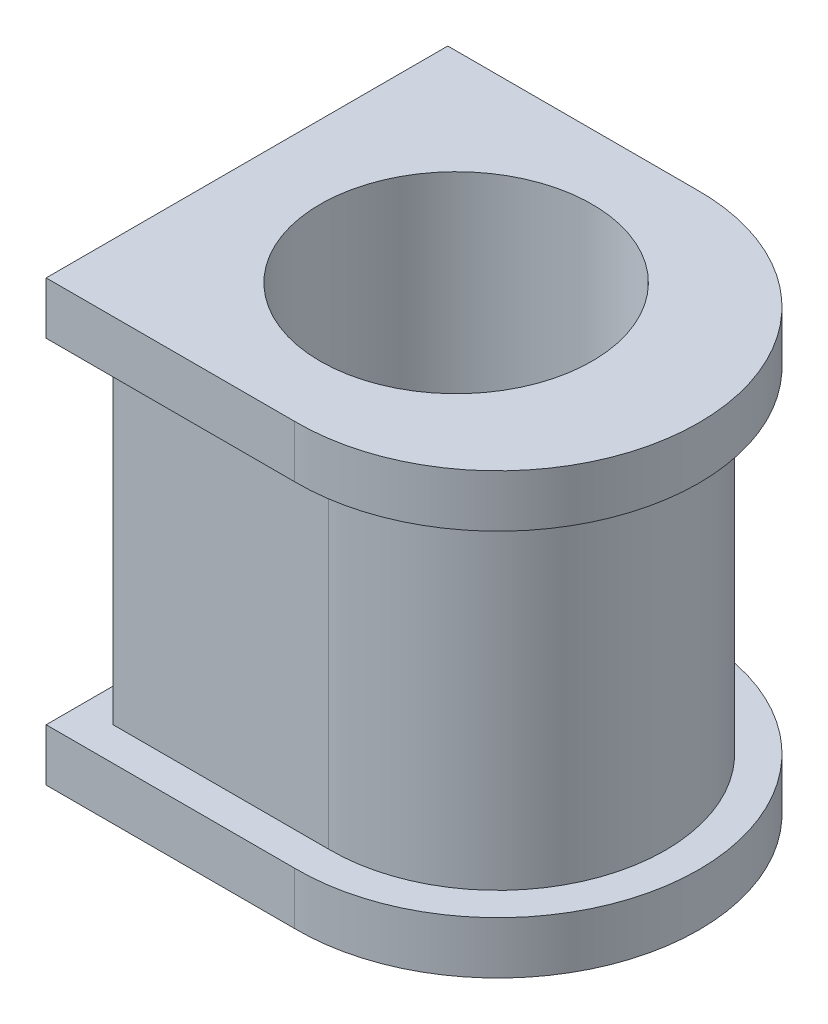
ISO-10303-21;
HEADER;
FILE_DESCRIPTION(('STEP AP214'),'2;1');
FILE_NAME('part.step','',(''),(''),'','','');
FILE_SCHEMA(('AUTOMOTIVE_DESIGN { 1 0 10303 214 1 1 1 1 }'));
ENDSEC;
DATA;
#1=APPLICATION_CONTEXT('core data for automotive mechanical design processes');
#2=APPLICATION_PROTOCOL_DEFINITION('international standard','automotive_design',2000,#1);
#3=PRODUCT_CONTEXT('',#1,'mechanical');
#4=PRODUCT('Part','Part','',(#3));
#5=PRODUCT_RELATED_PRODUCT_CATEGORY('part','',(#4));
#6=PRODUCT_DEFINITION_FORMATION('','',#4);
#7=PRODUCT_DEFINITION_CONTEXT('part definition',#1,'design');
#8=PRODUCT_DEFINITION('design','',#6,#7);
#9=PRODUCT_DEFINITION_SHAPE('','',#8);
#10=(LENGTH_UNIT() NAMED_UNIT(*) SI_UNIT(.MILLI.,.METRE.));
#11=(NAMED_UNIT(*) PLANE_ANGLE_UNIT() SI_UNIT($,.RADIAN.));
#12=(NAMED_UNIT(*) SI_UNIT($,.STERADIAN.) SOLID_ANGLE_UNIT());
#13=UNCERTAINTY_MEASURE_WITH_UNIT(LENGTH_MEASURE(1.E-05),#10,'distance_accuracy_value','');
#14=(GEOMETRIC_REPRESENTATION_CONTEXT(3) GLOBAL_UNCERTAINTY_ASSIGNED_CONTEXT((#13)) GLOBAL_UNIT_ASSIGNED_CONTEXT((#10,
#11,#12)) REPRESENTATION_CONTEXT('',''));
#15=CARTESIAN_POINT('',(0.,0.,0.));
#16=DIRECTION('',(0.,0.,1.));
#17=DIRECTION('',(1.,0.,0.));
#18=AXIS2_PLACEMENT_3D('',#15,#16,#17);
#19=CARTESIAN_POINT('',(-26.,80.,-40.));
#20=DIRECTION('',(1.,0.,0.));
#21=DIRECTION('',(0.,0.,-1.));
#22=AXIS2_PLACEMENT_3D('',#19,#20,#21);
#23=PLANE('',#22);
#24=DIRECTION('',(0.,0.,1.));
#25=VECTOR('',#24,1.);
#26=CARTESIAN_POINT('',(-26.,0.,-40.));
#27=LINE('',#26,#25);
#28=CARTESIAN_POINT('',(-26.,0.,-40.));
#29=VERTEX_POINT('',#28);
#30=CARTESIAN_POINT('',(-26.,0.,40.));
#31=VERTEX_POINT('',#30);
#32=EDGE_CURVE('E199',#29,#31,#27,.T.);
#33=ORIENTED_EDGE('',*,*,#32,.T.);
#34=DIRECTION('',(0.,-1.,0.));
#35=VECTOR('',#34,1.);
#36=CARTESIAN_POINT('',(-26.,80.,40.));
#37=LINE('',#36,#35);
#38=CARTESIAN_POINT('',(-26.,80.,40.));
#39=VERTEX_POINT('',#38);
#40=EDGE_CURVE('E11',#39,#31,#37,.T.);
#41=ORIENTED_EDGE('',*,*,#40,.F.);
#42=DIRECTION('',(0.,0.,1.));
#43=VECTOR('',#42,1.);
#44=CARTESIAN_POINT('',(-26.,80.,-40.));
#45=LINE('',#44,#43);
#46=CARTESIAN_POINT('',(-26.,80.,-40.));
#47=VERTEX_POINT('',#46);
#48=EDGE_CURVE('E200',#47,#39,#45,.T.);
#49=ORIENTED_EDGE('',*,*,#48,.F.);
#50=DIRECTION('',(0.,-1.,0.));
#51=VECTOR('',#50,1.);
#52=CARTESIAN_POINT('',(-26.,80.,-40.));
#53=LINE('',#52,#51);
#54=EDGE_CURVE('E213',#47,#29,#53,.T.);
#55=ORIENTED_EDGE('',*,*,#54,.T.);
#56=EDGE_LOOP('',(#33,#41,#49,#55));
#57=FACE_BOUND('',#56,.T.);
#58=ADVANCED_FACE('F37',(#57),#23,.F.);
#59=CARTESIAN_POINT('',(-26.,80.,40.));
#60=DIRECTION('',(0.,0.,-1.));
#61=DIRECTION('',(-1.,0.,0.));
#62=AXIS2_PLACEMENT_3D('',#59,#60,#61);
#63=PLANE('',#62);
#64=DIRECTION('',(1.,0.,0.));
#65=VECTOR('',#64,1.);
#66=CARTESIAN_POINT('',(-26.,0.,40.));
#67=LINE('',#66,#65);
#68=CARTESIAN_POINT('',(25.4504857740027,0.,40.));
#69=VERTEX_POINT('',#68);
#70=EDGE_CURVE('E216',#31,#69,#67,.T.);
#71=ORIENTED_EDGE('',*,*,#70,.T.);
#72=DIRECTION('',(0.,-1.,0.));
#73=VECTOR('',#72,1.);
#74=CARTESIAN_POINT('',(25.4504857740027,80.,40.));
#75=LINE('',#74,#73);
#76=CARTESIAN_POINT('',(25.4504857740027,80.,40.));
#77=VERTEX_POINT('',#76);
#78=EDGE_CURVE('E45',#77,#69,#75,.T.);
#79=ORIENTED_EDGE('',*,*,#78,.F.);
#80=DIRECTION('',(1.,0.,0.));
#81=VECTOR('',#80,1.);
#82=CARTESIAN_POINT('',(-26.,80.,40.));
#83=LINE('',#82,#81);
#84=EDGE_CURVE('E203',#39,#77,#83,.T.);
#85=ORIENTED_EDGE('',*,*,#84,.F.);
#86=ORIENTED_EDGE('',*,*,#40,.T.);
#87=EDGE_LOOP('',(#71,#79,#85,#86));
#88=FACE_BOUND('',#87,.T.);
#89=ADVANCED_FACE('F229',(#88),#63,.F.);
#90=CARTESIAN_POINT('',(26.,80.,0.));
#91=DIRECTION('',(0.,-1.,0.));
#92=DIRECTION('',(0.,0.,-1.));
#93=AXIS2_PLACEMENT_3D('',#90,#91,#92);
#94=CYLINDRICAL_SURFACE('',#93,40.0037743954814);
#95=CARTESIAN_POINT('',(26.,0.,0.));
#96=DIRECTION('',(0.,1.,0.));
#97=DIRECTION('',(0.,0.,1.));
#98=AXIS2_PLACEMENT_3D('',#95,#96,#97);
#99=CIRCLE('',#98,40.0037743954814);
#100=CARTESIAN_POINT('',(25.4504857740032,0.,-40.));
#101=VERTEX_POINT('',#100);
#102=EDGE_CURVE('E219',#69,#101,#99,.T.);
#103=ORIENTED_EDGE('',*,*,#102,.T.);
#104=DIRECTION('',(0.,-1.,0.));
#105=VECTOR('',#104,1.);
#106=CARTESIAN_POINT('',(25.4504857740032,80.,-40.));
#107=LINE('',#106,#105);
#108=CARTESIAN_POINT('',(25.4504857740032,80.,-40.));
#109=VERTEX_POINT('',#108);
#110=EDGE_CURVE('E52',#109,#101,#107,.T.);
#111=ORIENTED_EDGE('',*,*,#110,.F.);
#112=CARTESIAN_POINT('',(26.,80.,0.));
#113=DIRECTION('',(0.,1.,0.));
#114=DIRECTION('',(0.,0.,1.));
#115=AXIS2_PLACEMENT_3D('',#112,#113,#114);
#116=CIRCLE('',#115,40.0037743954814);
#117=EDGE_CURVE('E207',#77,#109,#116,.T.);
#118=ORIENTED_EDGE('',*,*,#117,.F.);
#119=ORIENTED_EDGE('',*,*,#78,.T.);
#120=EDGE_LOOP('',(#103,#111,#118,#119));
#121=FACE_BOUND('',#120,.T.);
#122=ADVANCED_FACE('F226',(#121),#94,.T.);
#123=CARTESIAN_POINT('',(-26.,80.,-40.));
#124=DIRECTION('',(0.,0.,1.));
#125=DIRECTION('',(1.,0.,0.));
#126=AXIS2_PLACEMENT_3D('',#123,#124,#125);
#127=PLANE('',#126);
#128=DIRECTION('',(-1.,0.,0.));
#129=VECTOR('',#128,1.);
#130=CARTESIAN_POINT('',(-26.,0.,-40.));
#131=LINE('',#130,#129);
#132=EDGE_CURVE('E204',#101,#29,#131,.T.);
#133=ORIENTED_EDGE('',*,*,#132,.T.);
#134=ORIENTED_EDGE('',*,*,#54,.F.);
#135=DIRECTION('',(-1.,0.,0.));
#136=VECTOR('',#135,1.);
#137=CARTESIAN_POINT('',(-26.,80.,-40.));
#138=LINE('',#137,#136);
#139=EDGE_CURVE('E210',#109,#47,#138,.T.);
#140=ORIENTED_EDGE('',*,*,#139,.F.);
#141=ORIENTED_EDGE('',*,*,#110,.T.);
#142=EDGE_LOOP('',(#133,#134,#140,#141));
#143=FACE_BOUND('',#142,.T.);
#144=ADVANCED_FACE('F236',(#143),#127,.F.);
#145=CARTESIAN_POINT('',(16.0000000000003,80.,0.));
#146=DIRECTION('',(0.,-1.,0.));
#147=DIRECTION('',(0.,0.,-1.));
#148=AXIS2_PLACEMENT_3D('',#145,#146,#147);
#149=CYLINDRICAL_SURFACE('',#148,32.5);
#150=CARTESIAN_POINT('',(16.0000000000003,92.5,0.));
#151=DIRECTION('',(0.,1.,0.));
#152=DIRECTION('',(0.,0.,1.));
#153=AXIS2_PLACEMENT_3D('',#150,#151,#152);
#154=CIRCLE('',#153,32.5);
#155=CARTESIAN_POINT('',(16.0000000000003,92.5,32.5));
#156=VERTEX_POINT('',#155);
#157=EDGE_CURVE('E133',#156,#156,#154,.T.);
#158=ORIENTED_EDGE('',*,*,#157,.T.);
#159=EDGE_LOOP('',(#158));
#160=FACE_BOUND('',#159,.T.);
#161=CARTESIAN_POINT('',(16.0000000000003,-12.5,0.));
#162=DIRECTION('',(0.,1.,0.));
#163=DIRECTION('',(0.,0.,1.));
#164=AXIS2_PLACEMENT_3D('',#161,#162,#163);
#165=CIRCLE('',#164,32.5);
#166=CARTESIAN_POINT('',(16.0000000000003,-12.5,32.5));
#167=VERTEX_POINT('',#166);
#168=EDGE_CURVE('E156',#167,#167,#165,.T.);
#169=ORIENTED_EDGE('',*,*,#168,.F.);
#170=EDGE_LOOP('',(#169));
#171=FACE_BOUND('',#170,.T.);
#172=ADVANCED_FACE('F242',(#160,#171),#149,.F.);
#173=CARTESIAN_POINT('',(26.,80.,0.));
#174=DIRECTION('',(0.,1.,0.));
#175=DIRECTION('',(0.,0.,1.));
#176=AXIS2_PLACEMENT_3D('',#173,#174,#175);
#177=PLANE('',#176);
#178=DIRECTION('',(-1.,0.,0.));
#179=VECTOR('',#178,1.);
#180=CARTESIAN_POINT('',(25.3980396921105,80.,-48.));
#181=LINE('',#180,#179);
#182=CARTESIAN_POINT('',(25.3980396921105,80.,-48.));
#183=VERTEX_POINT('',#182);
#184=CARTESIAN_POINT('',(-34.,80.,-48.));
#185=VERTEX_POINT('',#184);
#186=EDGE_CURVE('E169',#183,#185,#181,.T.);
#187=ORIENTED_EDGE('',*,*,#186,.F.);
#188=CARTESIAN_POINT('',(26.,80.,0.));
#189=DIRECTION('',(0.,1.,0.));
#190=DIRECTION('',(0.,0.,1.));
#191=AXIS2_PLACEMENT_3D('',#188,#189,#190);
#192=CIRCLE('',#191,48.0037743954814);
#193=CARTESIAN_POINT('',(25.3980396921096,80.,48.));
#194=VERTEX_POINT('',#193);
#195=EDGE_CURVE('E174',#194,#183,#192,.T.);
#196=ORIENTED_EDGE('',*,*,#195,.F.);
#197=DIRECTION('',(1.,0.,0.));
#198=VECTOR('',#197,1.);
#199=CARTESIAN_POINT('',(-34.,80.,48.));
#200=LINE('',#199,#198);
#201=CARTESIAN_POINT('',(-34.,80.,48.));
#202=VERTEX_POINT('',#201);
#203=EDGE_CURVE('E185',#202,#194,#200,.T.);
#204=ORIENTED_EDGE('',*,*,#203,.F.);
#205=DIRECTION('',(0.,0.,1.));
#206=VECTOR('',#205,1.);
#207=CARTESIAN_POINT('',(-34.,80.,-48.));
#208=LINE('',#207,#206);
#209=EDGE_CURVE('E183',#185,#202,#208,.T.);
#210=ORIENTED_EDGE('',*,*,#209,.F.);
#211=EDGE_LOOP('',(#187,#196,#204,#210));
#212=FACE_BOUND('',#211,.T.);
#213=ORIENTED_EDGE('',*,*,#139,.T.);
#214=ORIENTED_EDGE('',*,*,#48,.T.);
#215=ORIENTED_EDGE('',*,*,#84,.T.);
#216=ORIENTED_EDGE('',*,*,#117,.T.);
#217=EDGE_LOOP('',(#213,#214,#215,#216));
#218=FACE_BOUND('',#217,.T.);
#219=ADVANCED_FACE('F239',(#212,#218),#177,.F.);
#220=CARTESIAN_POINT('',(26.,92.5,0.));
#221=DIRECTION('',(0.,1.,0.));
#222=DIRECTION('',(0.,0.,1.));
#223=AXIS2_PLACEMENT_3D('',#220,#221,#222);
#224=PLANE('',#223);
#225=DIRECTION('',(-1.,0.,0.));
#226=VECTOR('',#225,1.);
#227=CARTESIAN_POINT('',(25.3980396921105,92.5,-48.));
#228=LINE('',#227,#226);
#229=CARTESIAN_POINT('',(25.3980396921105,92.5,-48.));
#230=VERTEX_POINT('',#229);
#231=CARTESIAN_POINT('',(-34.,92.5,-48.));
#232=VERTEX_POINT('',#231);
#233=EDGE_CURVE('E170',#230,#232,#228,.T.);
#234=ORIENTED_EDGE('',*,*,#233,.T.);
#235=DIRECTION('',(0.,0.,1.));
#236=VECTOR('',#235,1.);
#237=CARTESIAN_POINT('',(-34.,92.5,-48.));
#238=LINE('',#237,#236);
#239=CARTESIAN_POINT('',(-34.,92.5,48.));
#240=VERTEX_POINT('',#239);
#241=EDGE_CURVE('E173',#232,#240,#238,.T.);
#242=ORIENTED_EDGE('',*,*,#241,.T.);
#243=DIRECTION('',(1.,0.,0.));
#244=VECTOR('',#243,1.);
#245=CARTESIAN_POINT('',(-34.,92.5,48.));
#246=LINE('',#245,#244);
#247=CARTESIAN_POINT('',(25.3980396921096,92.5,48.));
#248=VERTEX_POINT('',#247);
#249=EDGE_CURVE('E176',#240,#248,#246,.T.);
#250=ORIENTED_EDGE('',*,*,#249,.T.);
#251=CARTESIAN_POINT('',(26.,92.5,0.));
#252=DIRECTION('',(0.,1.,0.));
#253=DIRECTION('',(0.,0.,1.));
#254=AXIS2_PLACEMENT_3D('',#251,#252,#253);
#255=CIRCLE('',#254,48.0037743954814);
#256=EDGE_CURVE('E178',#248,#230,#255,.T.);
#257=ORIENTED_EDGE('',*,*,#256,.T.);
#258=EDGE_LOOP('',(#234,#242,#250,#257));
#259=FACE_BOUND('',#258,.T.);
#260=ORIENTED_EDGE('',*,*,#157,.F.);
#261=EDGE_LOOP('',(#260));
#262=FACE_BOUND('',#261,.T.);
#263=ADVANCED_FACE('F241',(#259,#262),#224,.T.);
#264=CARTESIAN_POINT('',(25.3980396921105,92.5,-48.));
#265=DIRECTION('',(0.,0.,1.));
#266=DIRECTION('',(1.,0.,0.));
#267=AXIS2_PLACEMENT_3D('',#264,#265,#266);
#268=PLANE('',#267);
#269=ORIENTED_EDGE('',*,*,#186,.T.);
#270=DIRECTION('',(0.,-1.,0.));
#271=VECTOR('',#270,1.);
#272=CARTESIAN_POINT('',(-34.,92.5,-48.));
#273=LINE('',#272,#271);
#274=EDGE_CURVE('E196',#232,#185,#273,.T.);
#275=ORIENTED_EDGE('',*,*,#274,.F.);
#276=ORIENTED_EDGE('',*,*,#233,.F.);
#277=DIRECTION('',(0.,-1.,0.));
#278=VECTOR('',#277,1.);
#279=CARTESIAN_POINT('',(25.3980396921105,92.5,-48.));
#280=LINE('',#279,#278);
#281=EDGE_CURVE('E180',#230,#183,#280,.T.);
#282=ORIENTED_EDGE('',*,*,#281,.T.);
#283=EDGE_LOOP('',(#269,#275,#276,#282));
#284=FACE_BOUND('',#283,.T.);
#285=ADVANCED_FACE('F249',(#284),#268,.F.);
#286=CARTESIAN_POINT('',(-34.,92.5,-48.));
#287=DIRECTION('',(1.,0.,0.));
#288=DIRECTION('',(0.,0.,-1.));
#289=AXIS2_PLACEMENT_3D('',#286,#287,#288);
#290=PLANE('',#289);
#291=ORIENTED_EDGE('',*,*,#209,.T.);
#292=DIRECTION('',(0.,-1.,0.));
#293=VECTOR('',#292,1.);
#294=CARTESIAN_POINT('',(-34.,92.5,48.));
#295=LINE('',#294,#293);
#296=EDGE_CURVE('E193',#240,#202,#295,.T.);
#297=ORIENTED_EDGE('',*,*,#296,.F.);
#298=ORIENTED_EDGE('',*,*,#241,.F.);
#299=ORIENTED_EDGE('',*,*,#274,.T.);
#300=EDGE_LOOP('',(#291,#297,#298,#299));
#301=FACE_BOUND('',#300,.T.);
#302=ADVANCED_FACE('F269',(#301),#290,.F.);
#303=CARTESIAN_POINT('',(-34.,92.5,48.));
#304=DIRECTION('',(0.,0.,-1.));
#305=DIRECTION('',(-1.,0.,0.));
#306=AXIS2_PLACEMENT_3D('',#303,#304,#305);
#307=PLANE('',#306);
#308=ORIENTED_EDGE('',*,*,#203,.T.);
#309=DIRECTION('',(0.,-1.,0.));
#310=VECTOR('',#309,1.);
#311=CARTESIAN_POINT('',(25.3980396921096,92.5,48.));
#312=LINE('',#311,#310);
#313=EDGE_CURVE('E190',#248,#194,#312,.T.);
#314=ORIENTED_EDGE('',*,*,#313,.F.);
#315=ORIENTED_EDGE('',*,*,#249,.F.);
#316=ORIENTED_EDGE('',*,*,#296,.T.);
#317=EDGE_LOOP('',(#308,#314,#315,#316));
#318=FACE_BOUND('',#317,.T.);
#319=ADVANCED_FACE('F273',(#318),#307,.F.);
#320=CARTESIAN_POINT('',(26.,92.5,0.));
#321=DIRECTION('',(0.,-1.,0.));
#322=DIRECTION('',(0.,0.,-1.));
#323=AXIS2_PLACEMENT_3D('',#320,#321,#322);
#324=CYLINDRICAL_SURFACE('',#323,48.0037743954814);
#325=ORIENTED_EDGE('',*,*,#195,.T.);
#326=ORIENTED_EDGE('',*,*,#281,.F.);
#327=ORIENTED_EDGE('',*,*,#256,.F.);
#328=ORIENTED_EDGE('',*,*,#313,.T.);
#329=EDGE_LOOP('',(#325,#326,#327,#328));
#330=FACE_BOUND('',#329,.T.);
#331=ADVANCED_FACE('F276',(#330),#324,.T.);
#332=CARTESIAN_POINT('',(25.3980396921105,-12.5,-48.));
#333=DIRECTION('',(0.,0.,-1.));
#334=DIRECTION('',(-1.,0.,0.));
#335=AXIS2_PLACEMENT_3D('',#332,#333,#334);
#336=PLANE('',#335);
#337=DIRECTION('',(-1.,0.,0.));
#338=VECTOR('',#337,1.);
#339=CARTESIAN_POINT('',(25.3980396921105,0.,-48.));
#340=LINE('',#339,#338);
#341=CARTESIAN_POINT('',(25.3980396921105,0.,-48.));
#342=VERTEX_POINT('',#341);
#343=CARTESIAN_POINT('',(-34.,0.,-48.));
#344=VERTEX_POINT('',#343);
#345=EDGE_CURVE('E128',#342,#344,#340,.T.);
#346=ORIENTED_EDGE('',*,*,#345,.F.);
#347=DIRECTION('',(0.,1.,0.));
#348=VECTOR('',#347,1.);
#349=CARTESIAN_POINT('',(25.3980396921105,-12.5,-48.));
#350=LINE('',#349,#348);
#351=CARTESIAN_POINT('',(25.3980396921105,-12.5,-48.));
#352=VERTEX_POINT('',#351);
#353=EDGE_CURVE('E122',#352,#342,#350,.T.);
#354=ORIENTED_EDGE('',*,*,#353,.F.);
#355=DIRECTION('',(-1.,0.,0.));
#356=VECTOR('',#355,1.);
#357=CARTESIAN_POINT('',(25.3980396921105,-12.5,-48.));
#358=LINE('',#357,#356);
#359=CARTESIAN_POINT('',(-34.,-12.5,-48.));
#360=VERTEX_POINT('',#359);
#361=EDGE_CURVE('E125',#352,#360,#358,.T.);
#362=ORIENTED_EDGE('',*,*,#361,.T.);
#363=DIRECTION('',(0.,1.,0.));
#364=VECTOR('',#363,1.);
#365=CARTESIAN_POINT('',(-34.,-12.5,-48.));
#366=LINE('',#365,#364);
#367=EDGE_CURVE('E153',#360,#344,#366,.T.);
#368=ORIENTED_EDGE('',*,*,#367,.T.);
#369=EDGE_LOOP('',(#346,#354,#362,#368));
#370=FACE_BOUND('',#369,.T.);
#371=ADVANCED_FACE('F124',(#370),#336,.T.);
#372=CARTESIAN_POINT('',(26.,-12.5,0.));
#373=DIRECTION('',(0.,1.,0.));
#374=DIRECTION('',(0.,0.,1.));
#375=AXIS2_PLACEMENT_3D('',#372,#373,#374);
#376=CYLINDRICAL_SURFACE('',#375,48.0037743954814);
#377=CARTESIAN_POINT('',(26.,0.,0.));
#378=DIRECTION('',(0.,1.,0.));
#379=DIRECTION('',(0.,0.,1.));
#380=AXIS2_PLACEMENT_3D('',#377,#378,#379);
#381=CIRCLE('',#380,48.0037743954814);
#382=CARTESIAN_POINT('',(25.3980396921096,0.,48.));
#383=VERTEX_POINT('',#382);
#384=EDGE_CURVE('E155',#383,#342,#381,.T.);
#385=ORIENTED_EDGE('',*,*,#384,.F.);
#386=DIRECTION('',(0.,1.,0.));
#387=VECTOR('',#386,1.);
#388=CARTESIAN_POINT('',(25.3980396921096,-12.5,48.));
#389=LINE('',#388,#387);
#390=CARTESIAN_POINT('',(25.3980396921096,-12.5,48.));
#391=VERTEX_POINT('',#390);
#392=EDGE_CURVE('E134',#391,#383,#389,.T.);
#393=ORIENTED_EDGE('',*,*,#392,.F.);
#394=CARTESIAN_POINT('',(26.,-12.5,0.));
#395=DIRECTION('',(0.,1.,0.));
#396=DIRECTION('',(0.,0.,1.));
#397=AXIS2_PLACEMENT_3D('',#394,#395,#396);
#398=CIRCLE('',#397,48.0037743954814);
#399=EDGE_CURVE('E140',#391,#352,#398,.T.);
#400=ORIENTED_EDGE('',*,*,#399,.T.);
#401=ORIENTED_EDGE('',*,*,#353,.T.);
#402=EDGE_LOOP('',(#385,#393,#400,#401));
#403=FACE_BOUND('',#402,.T.);
#404=ADVANCED_FACE('F146',(#403),#376,.T.);
#405=CARTESIAN_POINT('',(-34.,-12.5,48.));
#406=DIRECTION('',(0.,0.,1.));
#407=DIRECTION('',(1.,0.,0.));
#408=AXIS2_PLACEMENT_3D('',#405,#406,#407);
#409=PLANE('',#408);
#410=DIRECTION('',(1.,0.,0.));
#411=VECTOR('',#410,1.);
#412=CARTESIAN_POINT('',(-34.,0.,48.));
#413=LINE('',#412,#411);
#414=CARTESIAN_POINT('',(-34.,0.,48.));
#415=VERTEX_POINT('',#414);
#416=EDGE_CURVE('E158',#415,#383,#413,.T.);
#417=ORIENTED_EDGE('',*,*,#416,.F.);
#418=DIRECTION('',(0.,1.,0.));
#419=VECTOR('',#418,1.);
#420=CARTESIAN_POINT('',(-34.,-12.5,48.));
#421=LINE('',#420,#419);
#422=CARTESIAN_POINT('',(-34.,-12.5,48.));
#423=VERTEX_POINT('',#422);
#424=EDGE_CURVE('E164',#423,#415,#421,.T.);
#425=ORIENTED_EDGE('',*,*,#424,.F.);
#426=DIRECTION('',(1.,0.,0.));
#427=VECTOR('',#426,1.);
#428=CARTESIAN_POINT('',(-34.,-12.5,48.));
#429=LINE('',#428,#427);
#430=EDGE_CURVE('E147',#423,#391,#429,.T.);
#431=ORIENTED_EDGE('',*,*,#430,.T.);
#432=ORIENTED_EDGE('',*,*,#392,.T.);
#433=EDGE_LOOP('',(#417,#425,#431,#432));
#434=FACE_BOUND('',#433,.T.);
#435=ADVANCED_FACE('F307',(#434),#409,.T.);
#436=CARTESIAN_POINT('',(-34.,-12.5,-48.));
#437=DIRECTION('',(-1.,0.,0.));
#438=DIRECTION('',(0.,0.,1.));
#439=AXIS2_PLACEMENT_3D('',#436,#437,#438);
#440=PLANE('',#439);
#441=DIRECTION('',(0.,0.,1.));
#442=VECTOR('',#441,1.);
#443=CARTESIAN_POINT('',(-34.,0.,-48.));
#444=LINE('',#443,#442);
#445=EDGE_CURVE('E144',#344,#415,#444,.T.);
#446=ORIENTED_EDGE('',*,*,#445,.F.);
#447=ORIENTED_EDGE('',*,*,#367,.F.);
#448=DIRECTION('',(0.,0.,1.));
#449=VECTOR('',#448,1.);
#450=CARTESIAN_POINT('',(-34.,-12.5,-48.));
#451=LINE('',#450,#449);
#452=EDGE_CURVE('E143',#360,#423,#451,.T.);
#453=ORIENTED_EDGE('',*,*,#452,.T.);
#454=ORIENTED_EDGE('',*,*,#424,.T.);
#455=EDGE_LOOP('',(#446,#447,#453,#454));
#456=FACE_BOUND('',#455,.T.);
#457=ADVANCED_FACE('F300',(#456),#440,.T.);
#458=CARTESIAN_POINT('',(26.,-12.5,0.));
#459=DIRECTION('',(0.,-1.,0.));
#460=DIRECTION('',(0.,0.,1.));
#461=AXIS2_PLACEMENT_3D('',#458,#459,#460);
#462=PLANE('',#461);
#463=ORIENTED_EDGE('',*,*,#168,.T.);
#464=EDGE_LOOP('',(#463));
#465=FACE_BOUND('',#464,.T.);
#466=ORIENTED_EDGE('',*,*,#361,.F.);
#467=ORIENTED_EDGE('',*,*,#399,.F.);
#468=ORIENTED_EDGE('',*,*,#430,.F.);
#469=ORIENTED_EDGE('',*,*,#452,.F.);
#470=EDGE_LOOP('',(#466,#467,#468,#469));
#471=FACE_BOUND('',#470,.T.);
#472=ADVANCED_FACE('F138',(#465,#471),#462,.T.);
#473=CARTESIAN_POINT('',(26.,0.,0.));
#474=DIRECTION('',(0.,-1.,0.));
#475=DIRECTION('',(0.,0.,1.));
#476=AXIS2_PLACEMENT_3D('',#473,#474,#475);
#477=PLANE('',#476);
#478=ORIENTED_EDGE('',*,*,#32,.F.);
#479=ORIENTED_EDGE('',*,*,#132,.F.);
#480=ORIENTED_EDGE('',*,*,#102,.F.);
#481=ORIENTED_EDGE('',*,*,#70,.F.);
#482=EDGE_LOOP('',(#478,#479,#480,#481));
#483=FACE_BOUND('',#482,.T.);
#484=ORIENTED_EDGE('',*,*,#345,.T.);
#485=ORIENTED_EDGE('',*,*,#445,.T.);
#486=ORIENTED_EDGE('',*,*,#416,.T.);
#487=ORIENTED_EDGE('',*,*,#384,.T.);
#488=EDGE_LOOP('',(#484,#485,#486,#487));
#489=FACE_BOUND('',#488,.T.);
#490=ADVANCED_FACE('F232',(#483,#489),#477,.F.);
#491=CLOSED_SHELL('',(#58,#89,#122,#144,#172,#219,#263,#285,#302,#319,#331,#371,#404,#435,#457,
#472,#490));
#492=MANIFOLD_SOLID_BREP('B2',#491);
#493=ADVANCED_BREP_SHAPE_REPRESENTATION('',(#18,#492),#14);
#494=SHAPE_DEFINITION_REPRESENTATION(#9,#493);
ENDSEC;
END-ISO-10303-21;
